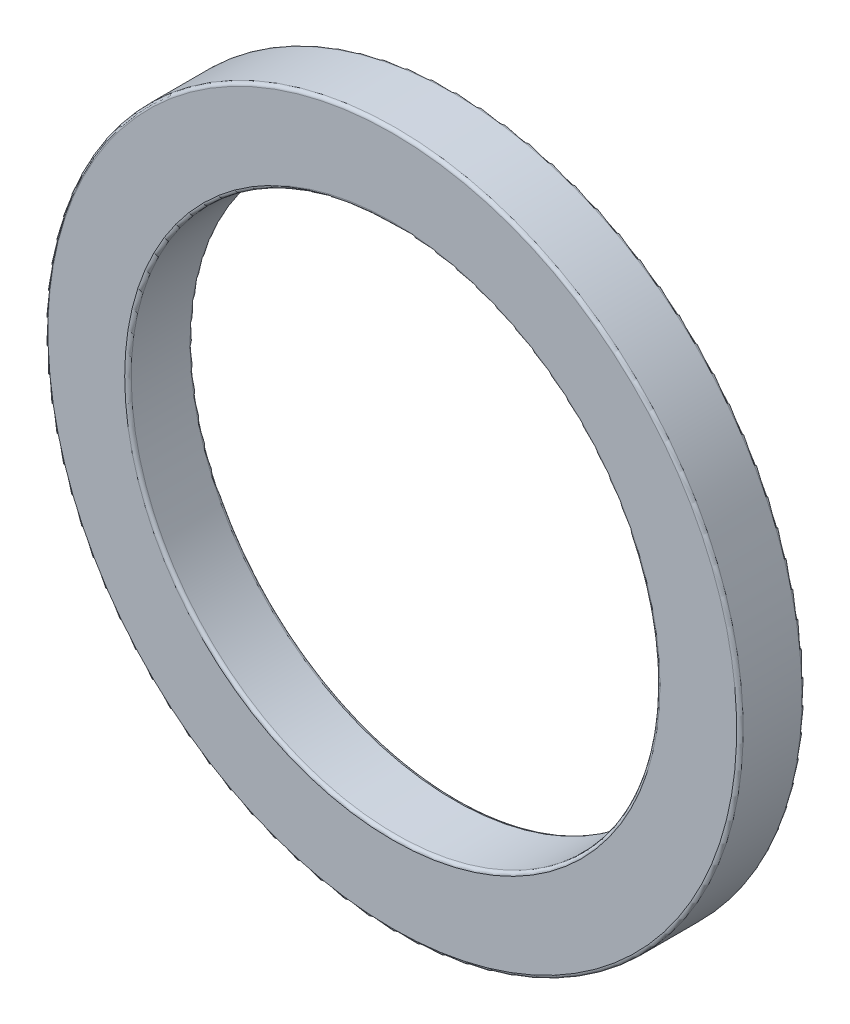
ISO-10303-21;
HEADER;
FILE_DESCRIPTION(('STEP AP214'),'2;1');
FILE_NAME('part.step','',(''),(''),'','','');
FILE_SCHEMA(('AUTOMOTIVE_DESIGN { 1 0 10303 214 1 1 1 1 }'));
ENDSEC;
DATA;
#1=APPLICATION_CONTEXT('core data for automotive mechanical design processes');
#2=APPLICATION_PROTOCOL_DEFINITION('international standard','automotive_design',2000,#1);
#3=PRODUCT_CONTEXT('',#1,'mechanical');
#4=PRODUCT('Part','Part','',(#3));
#5=PRODUCT_RELATED_PRODUCT_CATEGORY('part','',(#4));
#6=PRODUCT_DEFINITION_FORMATION('','',#4);
#7=PRODUCT_DEFINITION_CONTEXT('part definition',#1,'design');
#8=PRODUCT_DEFINITION('design','',#6,#7);
#9=PRODUCT_DEFINITION_SHAPE('','',#8);
#10=(LENGTH_UNIT() NAMED_UNIT(*) SI_UNIT(.MILLI.,.METRE.));
#11=(NAMED_UNIT(*) PLANE_ANGLE_UNIT() SI_UNIT($,.RADIAN.));
#12=(NAMED_UNIT(*) SI_UNIT($,.STERADIAN.) SOLID_ANGLE_UNIT());
#13=UNCERTAINTY_MEASURE_WITH_UNIT(LENGTH_MEASURE(1.E-05),#10,'distance_accuracy_value','');
#14=(GEOMETRIC_REPRESENTATION_CONTEXT(3) GLOBAL_UNCERTAINTY_ASSIGNED_CONTEXT((#13)) GLOBAL_UNIT_ASSIGNED_CONTEXT((#10,
#11,#12)) REPRESENTATION_CONTEXT('',''));
#15=CARTESIAN_POINT('',(0.,0.,0.));
#16=DIRECTION('',(0.,0.,1.));
#17=DIRECTION('',(1.,0.,0.));
#18=AXIS2_PLACEMENT_3D('',#15,#16,#17);
#19=CARTESIAN_POINT('',(10.97954595873,114.028,108.6676));
#20=DIRECTION('',(0.,0.,1.));
#21=DIRECTION('',(0.,1.,0.));
#22=AXIS2_PLACEMENT_3D('',#19,#20,#21);
#23=PLANE('',#22);
#24=CARTESIAN_POINT('',(0.,125.,108.6676));
#25=DIRECTION('',(0.,0.,1.));
#26=DIRECTION('',(8.39363704359224E-12,-1.,0.));
#27=AXIS2_PLACEMENT_3D('',#24,#25,#26);
#28=CIRCLE('',#27,8.19999999997298);
#29=CARTESIAN_POINT('',(-1.53363649904592E-11,133.199999999984,108.6676));
#30=VERTEX_POINT('',#29);
#31=CARTESIAN_POINT('',(4.12966535967558E-11,116.800000000016,108.6676));
#32=VERTEX_POINT('',#31);
#33=EDGE_CURVE('E64',#30,#32,#28,.F.);
#34=ORIENTED_EDGE('',*,*,#33,.T.);
#35=CARTESIAN_POINT('',(0.,125.,108.6676));
#36=DIRECTION('',(0.,0.,1.));
#37=DIRECTION('',(-4.78757896514636E-13,1.,0.));
#38=AXIS2_PLACEMENT_3D('',#35,#36,#37);
#39=CIRCLE('',#38,8.19999999997298);
#40=EDGE_CURVE('E102',#32,#30,#39,.F.);
#41=ORIENTED_EDGE('',*,*,#40,.T.);
#42=EDGE_LOOP('',(#34,#41));
#43=FACE_BOUND('',#42,.T.);
#44=CARTESIAN_POINT('',(0.,125.,108.6676));
#45=DIRECTION('',(0.,0.,-1.));
#46=DIRECTION('',(2.3613615012827E-12,1.,0.));
#47=AXIS2_PLACEMENT_3D('',#44,#45,#46);
#48=CIRCLE('',#47,10.5499999999875);
#49=CARTESIAN_POINT('',(-4.818769081677E-12,114.450000000008,108.6676));
#50=VERTEX_POINT('',#49);
#51=CARTESIAN_POINT('',(1.49465238363095E-11,135.549999999992,108.6676));
#52=VERTEX_POINT('',#51);
#53=EDGE_CURVE('E58',#50,#52,#48,.F.);
#54=ORIENTED_EDGE('',*,*,#53,.T.);
#55=CARTESIAN_POINT('',(0.,125.,108.6676));
#56=DIRECTION('',(0.,0.,-1.));
#57=DIRECTION('',(0.,-1.,0.));
#58=AXIS2_PLACEMENT_3D('',#55,#56,#57);
#59=CIRCLE('',#58,10.5499999999874);
#60=EDGE_CURVE('E55',#52,#50,#59,.F.);
#61=ORIENTED_EDGE('',*,*,#60,.T.);
#62=EDGE_LOOP('',(#54,#61));
#63=FACE_BOUND('',#62,.T.);
#64=ADVANCED_FACE('F16',(#43,#63),#23,.T.);
#65=CARTESIAN_POINT('',(0.,125.,108.5676));
#66=DIRECTION('',(0.,0.,1.));
#67=DIRECTION('',(0.00435860344367723,0.999990501242897,0.));
#68=AXIS2_PLACEMENT_3D('',#65,#66,#67);
#69=TOROIDAL_SURFACE('',#68,10.5499999999874,0.1);
#70=CARTESIAN_POINT('',(0.,125.,108.567599999958));
#71=DIRECTION('',(0.,0.,1.));
#72=DIRECTION('',(0.,1.,0.));
#73=AXIS2_PLACEMENT_3D('',#70,#71,#72);
#74=CIRCLE('',#73,10.65);
#75=CARTESIAN_POINT('',(0.,135.65,108.567599999958));
#76=VERTEX_POINT('',#75);
#77=EDGE_CURVE('E105',#76,#76,#74,.T.);
#78=ORIENTED_EDGE('',*,*,#77,.T.);
#79=EDGE_LOOP('',(#78));
#80=FACE_BOUND('',#79,.T.);
#81=ORIENTED_EDGE('',*,*,#53,.F.);
#82=ORIENTED_EDGE('',*,*,#60,.F.);
#83=EDGE_LOOP('',(#81,#82));
#84=FACE_BOUND('',#83,.T.);
#85=ADVANCED_FACE('F59',(#80,#84),#69,.T.);
#86=CARTESIAN_POINT('',(0.,125.,108.5676));
#87=DIRECTION('',(0.,0.,1.));
#88=DIRECTION('',(0.00814079416450072,-0.999966863186161,0.));
#89=AXIS2_PLACEMENT_3D('',#86,#87,#88);
#90=TOROIDAL_SURFACE('',#89,8.19999999997348,0.1);
#91=CARTESIAN_POINT('',(0.,125.,108.567599999958));
#92=DIRECTION('',(0.,0.,1.));
#93=DIRECTION('',(0.,1.,0.));
#94=AXIS2_PLACEMENT_3D('',#91,#92,#93);
#95=CIRCLE('',#94,8.1);
#96=CARTESIAN_POINT('',(0.,133.1,108.567599999958));
#97=VERTEX_POINT('',#96);
#98=EDGE_CURVE('E107',#97,#97,#95,.T.);
#99=ORIENTED_EDGE('',*,*,#98,.F.);
#100=EDGE_LOOP('',(#99));
#101=FACE_BOUND('',#100,.T.);
#102=ORIENTED_EDGE('',*,*,#33,.F.);
#103=ORIENTED_EDGE('',*,*,#40,.F.);
#104=EDGE_LOOP('',(#102,#103));
#105=FACE_BOUND('',#104,.T.);
#106=ADVANCED_FACE('F121',(#101,#105),#90,.T.);
#107=CARTESIAN_POINT('',(0.,125.,106.767600000042));
#108=DIRECTION('',(0.,0.,1.));
#109=DIRECTION('',(1.,0.,0.));
#110=AXIS2_PLACEMENT_3D('',#107,#108,#109);
#111=CYLINDRICAL_SURFACE('',#110,10.65);
#112=CARTESIAN_POINT('',(0.,125.,106.7676));
#113=DIRECTION('',(0.,0.,1.));
#114=DIRECTION('',(0.00619161875753001,-0.99998083174487,0.));
#115=AXIS2_PLACEMENT_3D('',#112,#113,#114);
#116=CIRCLE('',#115,10.6499999999916);
#117=CARTESIAN_POINT('',(0.0659407397676425,114.350204141926,106.7676));
#118=VERTEX_POINT('',#117);
#119=EDGE_CURVE('E112',#118,#118,#116,.T.);
#120=ORIENTED_EDGE('',*,*,#119,.T.);
#121=EDGE_LOOP('',(#120));
#122=FACE_BOUND('',#121,.T.);
#123=ORIENTED_EDGE('',*,*,#77,.F.);
#124=EDGE_LOOP('',(#123));
#125=FACE_BOUND('',#124,.T.);
#126=ADVANCED_FACE('F130',(#122,#125),#111,.T.);
#127=CARTESIAN_POINT('',(0.,125.,106.767600000042));
#128=DIRECTION('',(0.,0.,1.));
#129=DIRECTION('',(1.,0.,0.));
#130=AXIS2_PLACEMENT_3D('',#127,#128,#129);
#131=CYLINDRICAL_SURFACE('',#130,8.09999999999998);
#132=ORIENTED_EDGE('',*,*,#98,.T.);
#133=EDGE_LOOP('',(#132));
#134=FACE_BOUND('',#133,.T.);
#135=CARTESIAN_POINT('',(0.,125.,106.7676));
#136=DIRECTION('',(0.,0.,1.));
#137=DIRECTION('',(0.00573074315663642,0.999983579156614,0.));
#138=AXIS2_PLACEMENT_3D('',#135,#136,#137);
#139=CIRCLE('',#138,8.10000000001574);
#140=CARTESIAN_POINT('',(0.0464190195688452,133.099866991184,106.7676));
#141=VERTEX_POINT('',#140);
#142=EDGE_CURVE('E178',#141,#141,#139,.F.);
#143=ORIENTED_EDGE('',*,*,#142,.T.);
#144=EDGE_LOOP('',(#143));
#145=FACE_BOUND('',#144,.T.);
#146=ADVANCED_FACE('F160',(#134,#145),#131,.F.);
#147=CARTESIAN_POINT('',(0.,125.,106.7676));
#148=DIRECTION('',(0.,0.,1.));
#149=DIRECTION('',(0.00619161875753006,-0.99998083174487,0.));
#150=AXIS2_PLACEMENT_3D('',#147,#148,#149);
#151=TOROIDAL_SURFACE('',#150,10.5499999999916,0.1);
#152=ORIENTED_EDGE('',*,*,#119,.F.);
#153=EDGE_LOOP('',(#152));
#154=FACE_BOUND('',#153,.T.);
#155=CARTESIAN_POINT('',(0.,125.,106.6676));
#156=DIRECTION('',(0.,0.,1.));
#157=DIRECTION('',(4.68469114294432E-13,-1.,0.));
#158=AXIS2_PLACEMENT_3D('',#155,#156,#157);
#159=CIRCLE('',#158,10.5499999999916);
#160=CARTESIAN_POINT('',(1.82467051450946E-11,114.450000000005,106.6676));
#161=VERTEX_POINT('',#160);
#162=CARTESIAN_POINT('',(-1.06064191717631E-11,135.549999999995,106.6676));
#163=VERTEX_POINT('',#162);
#164=EDGE_CURVE('E186',#161,#163,#159,.T.);
#165=ORIENTED_EDGE('',*,*,#164,.T.);
#166=CARTESIAN_POINT('',(0.,125.,106.6676));
#167=DIRECTION('',(0.,0.,1.));
#168=DIRECTION('',(-4.68591151268824E-13,1.,0.));
#169=AXIS2_PLACEMENT_3D('',#166,#167,#168);
#170=CIRCLE('',#169,10.5499999999916);
#171=EDGE_CURVE('E174',#163,#161,#170,.T.);
#172=ORIENTED_EDGE('',*,*,#171,.T.);
#173=EDGE_LOOP('',(#165,#172));
#174=FACE_BOUND('',#173,.T.);
#175=ADVANCED_FACE('F149',(#154,#174),#151,.T.);
#176=CARTESIAN_POINT('',(0.,125.,106.7676));
#177=DIRECTION('',(0.,0.,1.));
#178=DIRECTION('',(0.00573074315663657,0.999983579156614,0.));
#179=AXIS2_PLACEMENT_3D('',#176,#177,#178);
#180=TOROIDAL_SURFACE('',#179,8.20000000001573,0.1);
#181=ORIENTED_EDGE('',*,*,#142,.F.);
#182=EDGE_LOOP('',(#181));
#183=FACE_BOUND('',#182,.T.);
#184=CARTESIAN_POINT('',(0.,125.,106.6676));
#185=DIRECTION('',(0.,0.,-1.));
#186=DIRECTION('',(-4.85510195255561E-13,1.,0.));
#187=AXIS2_PLACEMENT_3D('',#184,#185,#186);
#188=CIRCLE('',#187,8.20000000001564);
#189=CARTESIAN_POINT('',(1.47254265530325E-11,133.200000000009,106.6676));
#190=VERTEX_POINT('',#189);
#191=CARTESIAN_POINT('',(-6.16757757062118E-12,116.799999999991,106.6676));
#192=VERTEX_POINT('',#191);
#193=EDGE_CURVE('E29',#190,#192,#188,.T.);
#194=ORIENTED_EDGE('',*,*,#193,.T.);
#195=CARTESIAN_POINT('',(0.,125.,106.6676));
#196=DIRECTION('',(0.,0.,-1.));
#197=DIRECTION('',(4.85520938112454E-13,-1.,0.));
#198=AXIS2_PLACEMENT_3D('',#195,#196,#197);
#199=CIRCLE('',#198,8.20000000001563);
#200=EDGE_CURVE('E11',#192,#190,#199,.T.);
#201=ORIENTED_EDGE('',*,*,#200,.T.);
#202=EDGE_LOOP('',(#194,#201));
#203=FACE_BOUND('',#202,.T.);
#204=ADVANCED_FACE('F159',(#183,#203),#180,.T.);
#205=CARTESIAN_POINT('',(10.97954595873,114.028,106.6676));
#206=DIRECTION('',(0.,0.,1.));
#207=DIRECTION('',(0.,1.,0.));
#208=AXIS2_PLACEMENT_3D('',#205,#206,#207);
#209=PLANE('',#208);
#210=ORIENTED_EDGE('',*,*,#193,.F.);
#211=ORIENTED_EDGE('',*,*,#200,.F.);
#212=EDGE_LOOP('',(#210,#211));
#213=FACE_BOUND('',#212,.T.);
#214=ORIENTED_EDGE('',*,*,#164,.F.);
#215=ORIENTED_EDGE('',*,*,#171,.F.);
#216=EDGE_LOOP('',(#214,#215));
#217=FACE_BOUND('',#216,.T.);
#218=ADVANCED_FACE('F18',(#213,#217),#209,.F.);
#219=CLOSED_SHELL('',(#64,#85,#106,#126,#146,#175,#204,#218));
#220=MANIFOLD_SOLID_BREP('B1',#219);
#221=ADVANCED_BREP_SHAPE_REPRESENTATION('',(#18,#220),#14);
#222=SHAPE_DEFINITION_REPRESENTATION(#9,#221);
ENDSEC;
END-ISO-10303-21;
